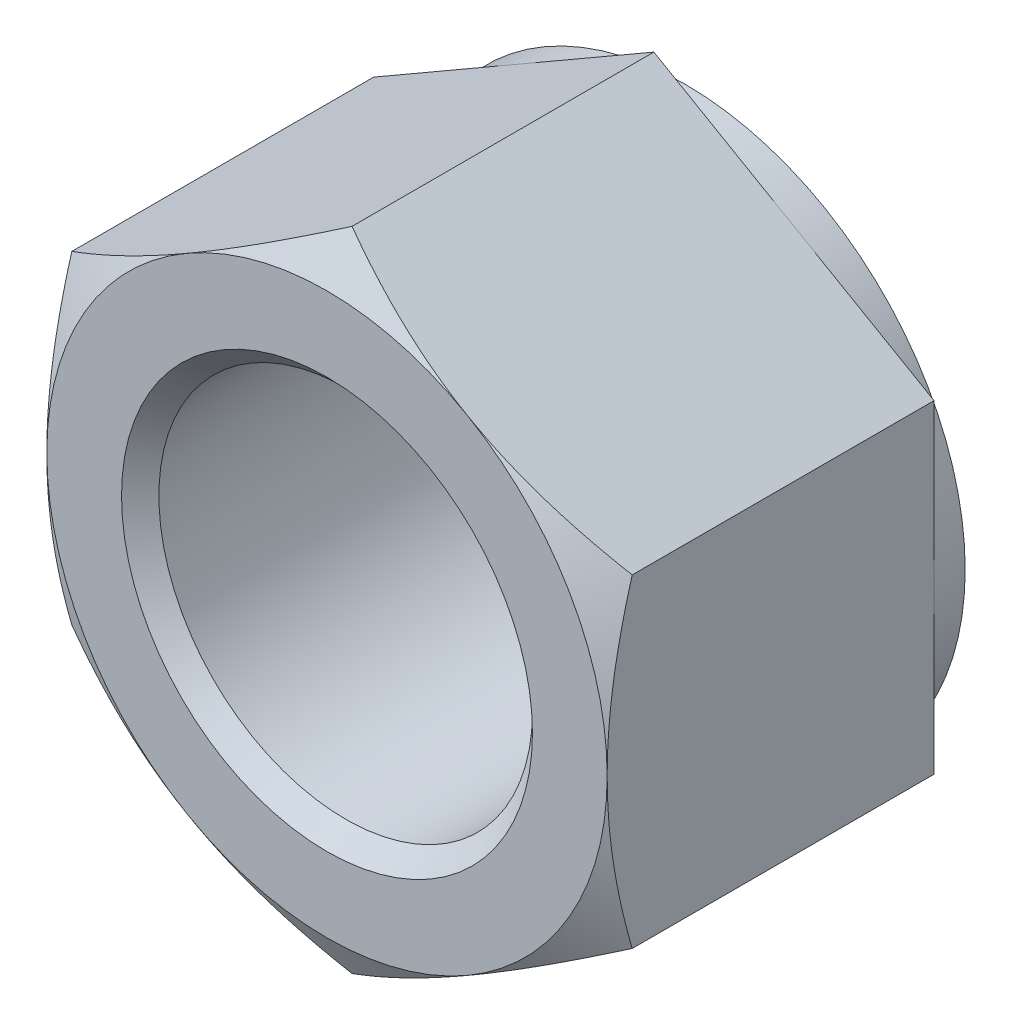
ISO-10303-21;
HEADER;
FILE_DESCRIPTION(('STEP AP214'),'2;1');
FILE_NAME('part.step','',(''),(''),'','','');
FILE_SCHEMA(('AUTOMOTIVE_DESIGN { 1 0 10303 214 1 1 1 1 }'));
ENDSEC;
DATA;
#1=APPLICATION_CONTEXT('core data for automotive mechanical design processes');
#2=APPLICATION_PROTOCOL_DEFINITION('international standard','automotive_design',2000,#1);
#3=PRODUCT_CONTEXT('',#1,'mechanical');
#4=PRODUCT('Part','Part','',(#3));
#5=PRODUCT_RELATED_PRODUCT_CATEGORY('part','',(#4));
#6=PRODUCT_DEFINITION_FORMATION('','',#4);
#7=PRODUCT_DEFINITION_CONTEXT('part definition',#1,'design');
#8=PRODUCT_DEFINITION('design','',#6,#7);
#9=PRODUCT_DEFINITION_SHAPE('','',#8);
#10=(LENGTH_UNIT() NAMED_UNIT(*) SI_UNIT(.MILLI.,.METRE.));
#11=(NAMED_UNIT(*) PLANE_ANGLE_UNIT() SI_UNIT($,.RADIAN.));
#12=(NAMED_UNIT(*) SI_UNIT($,.STERADIAN.) SOLID_ANGLE_UNIT());
#13=UNCERTAINTY_MEASURE_WITH_UNIT(LENGTH_MEASURE(1.E-05),#10,'distance_accuracy_value','');
#14=(GEOMETRIC_REPRESENTATION_CONTEXT(3) GLOBAL_UNCERTAINTY_ASSIGNED_CONTEXT((#13)) GLOBAL_UNIT_ASSIGNED_CONTEXT((#10,
#11,#12)) REPRESENTATION_CONTEXT('',''));
#15=CARTESIAN_POINT('',(0.,0.,0.));
#16=DIRECTION('',(0.,0.,1.));
#17=DIRECTION('',(1.,0.,0.));
#18=AXIS2_PLACEMENT_3D('',#15,#16,#17);
#19=CARTESIAN_POINT('',(0.,-2.59807621135332,0.));
#20=DIRECTION('',(-0.5,-0.866025403784439,0.));
#21=DIRECTION('',(0.,0.,-1.));
#22=AXIS2_PLACEMENT_3D('',#19,#20,#21);
#23=PLANE('',#22);
#24=CARTESIAN_POINT('',(-1.125,-1.94855715851499,1.3125));
#25=CARTESIAN_POINT('',(-1.64711431702998,-1.64711431702997,1.3125));
#26=CARTESIAN_POINT('',(-2.25,-1.29903810567666,1.11153810567666));
#27=(BOUNDED_CURVE() B_SPLINE_CURVE(2,(#24,#25,#26),.UNSPECIFIED.,.F.,
.F.) B_SPLINE_CURVE_WITH_KNOTS((3,3),(0.314084791435265,0.471127187152897),
.UNSPECIFIED.) CURVE() GEOMETRIC_REPRESENTATION_ITEM() RATIONAL_B_SPLINE_CURVE((1.,
1.07735026918963,1.07735026918963)) REPRESENTATION_ITEM(''));
#28=CARTESIAN_POINT('',(-1.125,-1.94855715851499,1.3125));
#29=VERTEX_POINT('',#28);
#30=CARTESIAN_POINT('',(-2.25,-1.29903810567666,1.11153810567666));
#31=VERTEX_POINT('',#30);
#32=EDGE_CURVE('E147',#29,#31,#27,.T.);
#33=ORIENTED_EDGE('',*,*,#32,.T.);
#34=DIRECTION('',(0.,0.,-1.));
#35=VECTOR('',#34,1.);
#36=CARTESIAN_POINT('',(-2.25,-1.29903810567666,0.));
#37=LINE('',#36,#35);
#38=CARTESIAN_POINT('',(-2.25,-1.29903810567666,-1.3125));
#39=VERTEX_POINT('',#38);
#40=EDGE_CURVE('E182',#31,#39,#37,.T.);
#41=ORIENTED_EDGE('',*,*,#40,.T.);
#42=DIRECTION('',(0.866025403784439,-0.5,0.));
#43=VECTOR('',#42,1.);
#44=CARTESIAN_POINT('',(0.,-2.59807621135332,-1.3125));
#45=LINE('',#44,#43);
#46=CARTESIAN_POINT('',(-1.125,-1.94855715851499,-1.3125));
#47=VERTEX_POINT('',#46);
#48=EDGE_CURVE('E135',#39,#47,#45,.T.);
#49=ORIENTED_EDGE('',*,*,#48,.T.);
#50=DIRECTION('',(0.866025403784439,-0.5,0.));
#51=VECTOR('',#50,1.);
#52=CARTESIAN_POINT('',(0.,-2.59807621135332,-1.3125));
#53=LINE('',#52,#51);
#54=CARTESIAN_POINT('',(0.,-2.59807621135332,-1.3125));
#55=VERTEX_POINT('',#54);
#56=EDGE_CURVE('E125',#47,#55,#53,.T.);
#57=ORIENTED_EDGE('',*,*,#56,.T.);
#58=DIRECTION('',(0.,0.,-1.));
#59=VECTOR('',#58,1.);
#60=CARTESIAN_POINT('',(0.,-2.59807621135332,0.));
#61=LINE('',#60,#59);
#62=CARTESIAN_POINT('',(0.,-2.59807621135332,1.11153810567666));
#63=VERTEX_POINT('',#62);
#64=EDGE_CURVE('E11',#63,#55,#61,.T.);
#65=ORIENTED_EDGE('',*,*,#64,.F.);
#66=CARTESIAN_POINT('',(0.,-2.59807621135332,1.11153810567666));
#67=CARTESIAN_POINT('',(-0.602885682970024,-2.25,1.3125));
#68=CARTESIAN_POINT('',(-1.125,-1.94855715851499,1.3125));
#69=(BOUNDED_CURVE() B_SPLINE_CURVE(2,(#66,#67,#68),.UNSPECIFIED.,.F.,
.F.) B_SPLINE_CURVE_WITH_KNOTS((3,3),(0.157042395717633,0.314084791435265),
.UNSPECIFIED.) CURVE() GEOMETRIC_REPRESENTATION_ITEM() RATIONAL_B_SPLINE_CURVE((1.07735026918962,
1.07735026918962,1.)) REPRESENTATION_ITEM(''));
#70=EDGE_CURVE('E243',#63,#29,#69,.T.);
#71=ORIENTED_EDGE('',*,*,#70,.T.);
#72=EDGE_LOOP('',(#33,#41,#49,#57,#65,#71));
#73=FACE_BOUND('',#72,.T.);
#74=ADVANCED_FACE('F16',(#73),#23,.T.);
#75=CARTESIAN_POINT('',(2.25,-1.29903810567666,0.));
#76=DIRECTION('',(0.5,-0.866025403784439,0.));
#77=DIRECTION('',(0.,0.,-1.));
#78=AXIS2_PLACEMENT_3D('',#75,#76,#77);
#79=PLANE('',#78);
#80=CARTESIAN_POINT('',(1.125,-1.94855715851499,1.3125));
#81=CARTESIAN_POINT('',(0.602885682970024,-2.25,1.3125));
#82=CARTESIAN_POINT('',(0.,-2.59807621135332,1.11153810567666));
#83=(BOUNDED_CURVE() B_SPLINE_CURVE(2,(#80,#81,#82),.UNSPECIFIED.,.F.,
.F.) B_SPLINE_CURVE_WITH_KNOTS((3,3),(0.314084791435265,0.471127187152897),
.UNSPECIFIED.) CURVE() GEOMETRIC_REPRESENTATION_ITEM() RATIONAL_B_SPLINE_CURVE((1.,
1.07735026918963,1.07735026918963)) REPRESENTATION_ITEM(''));
#84=CARTESIAN_POINT('',(1.125,-1.94855715851499,1.3125));
#85=VERTEX_POINT('',#84);
#86=EDGE_CURVE('E166',#85,#63,#83,.T.);
#87=ORIENTED_EDGE('',*,*,#86,.T.);
#88=ORIENTED_EDGE('',*,*,#64,.T.);
#89=DIRECTION('',(0.866025403784439,0.5,0.));
#90=VECTOR('',#89,1.);
#91=CARTESIAN_POINT('',(2.25,-1.29903810567666,-1.3125));
#92=LINE('',#91,#90);
#93=CARTESIAN_POINT('',(1.125,-1.94855715851499,-1.3125));
#94=VERTEX_POINT('',#93);
#95=EDGE_CURVE('E118',#55,#94,#92,.T.);
#96=ORIENTED_EDGE('',*,*,#95,.T.);
#97=DIRECTION('',(0.866025403784439,0.5,0.));
#98=VECTOR('',#97,1.);
#99=CARTESIAN_POINT('',(2.25,-1.29903810567666,-1.3125));
#100=LINE('',#99,#98);
#101=CARTESIAN_POINT('',(2.25,-1.29903810567666,-1.3125));
#102=VERTEX_POINT('',#101);
#103=EDGE_CURVE('E105',#94,#102,#100,.T.);
#104=ORIENTED_EDGE('',*,*,#103,.T.);
#105=DIRECTION('',(0.,0.,-1.));
#106=VECTOR('',#105,1.);
#107=CARTESIAN_POINT('',(2.25,-1.29903810567666,0.));
#108=LINE('',#107,#106);
#109=CARTESIAN_POINT('',(2.25,-1.29903810567666,1.11153810567666));
#110=VERTEX_POINT('',#109);
#111=EDGE_CURVE('E27',#110,#102,#108,.T.);
#112=ORIENTED_EDGE('',*,*,#111,.F.);
#113=CARTESIAN_POINT('',(2.25,-1.29903810567666,1.11153810567666));
#114=CARTESIAN_POINT('',(1.64711431702998,-1.64711431702997,1.3125));
#115=CARTESIAN_POINT('',(1.125,-1.94855715851499,1.3125));
#116=(BOUNDED_CURVE() B_SPLINE_CURVE(2,(#113,#114,#115),.UNSPECIFIED.,.F.,
.F.) B_SPLINE_CURVE_WITH_KNOTS((3,3),(0.157042395717633,0.314084791435265),
.UNSPECIFIED.) CURVE() GEOMETRIC_REPRESENTATION_ITEM() RATIONAL_B_SPLINE_CURVE((1.07735026918963,
1.07735026918963,1.)) REPRESENTATION_ITEM(''));
#117=EDGE_CURVE('E200',#110,#85,#116,.T.);
#118=ORIENTED_EDGE('',*,*,#117,.T.);
#119=EDGE_LOOP('',(#87,#88,#96,#104,#112,#118));
#120=FACE_BOUND('',#119,.T.);
#121=ADVANCED_FACE('F121',(#120),#79,.T.);
#122=CARTESIAN_POINT('',(2.25,1.29903810567665,0.));
#123=DIRECTION('',(1.,0.,0.));
#124=DIRECTION('',(0.,0.,-1.));
#125=AXIS2_PLACEMENT_3D('',#122,#123,#124);
#126=PLANE('',#125);
#127=CARTESIAN_POINT('',(2.25,0.,1.3125));
#128=CARTESIAN_POINT('',(2.25,-0.602885682970031,1.3125));
#129=CARTESIAN_POINT('',(2.25,-1.29903810567666,1.11153810567666));
#130=(BOUNDED_CURVE() B_SPLINE_CURVE(2,(#127,#128,#129),.UNSPECIFIED.,.F.,
.F.) B_SPLINE_CURVE_WITH_KNOTS((3,3),(0.314084791435265,0.471127187152897),
.UNSPECIFIED.) CURVE() GEOMETRIC_REPRESENTATION_ITEM() RATIONAL_B_SPLINE_CURVE((1.,
1.07735026918962,1.07735026918962)) REPRESENTATION_ITEM(''));
#131=CARTESIAN_POINT('',(2.25,0.,1.3125));
#132=VERTEX_POINT('',#131);
#133=EDGE_CURVE('E205',#132,#110,#130,.T.);
#134=ORIENTED_EDGE('',*,*,#133,.T.);
#135=ORIENTED_EDGE('',*,*,#111,.T.);
#136=DIRECTION('',(0.,1.,0.));
#137=VECTOR('',#136,1.);
#138=CARTESIAN_POINT('',(2.25,1.29903810567665,-1.3125));
#139=LINE('',#138,#137);
#140=CARTESIAN_POINT('',(2.25,0.,-1.3125));
#141=VERTEX_POINT('',#140);
#142=EDGE_CURVE('E20',#102,#141,#139,.T.);
#143=ORIENTED_EDGE('',*,*,#142,.T.);
#144=DIRECTION('',(0.,1.,0.));
#145=VECTOR('',#144,1.);
#146=CARTESIAN_POINT('',(2.25,1.29903810567665,-1.3125));
#147=LINE('',#146,#145);
#148=CARTESIAN_POINT('',(2.25,1.29903810567665,-1.3125));
#149=VERTEX_POINT('',#148);
#150=EDGE_CURVE('E196',#141,#149,#147,.T.);
#151=ORIENTED_EDGE('',*,*,#150,.T.);
#152=DIRECTION('',(0.,0.,-1.));
#153=VECTOR('',#152,1.);
#154=CARTESIAN_POINT('',(2.25,1.29903810567665,0.));
#155=LINE('',#154,#153);
#156=CARTESIAN_POINT('',(2.25,1.29903810567665,1.11153810567666));
#157=VERTEX_POINT('',#156);
#158=EDGE_CURVE('E36',#157,#149,#155,.T.);
#159=ORIENTED_EDGE('',*,*,#158,.F.);
#160=CARTESIAN_POINT('',(2.25,1.29903810567666,1.11153810567666));
#161=CARTESIAN_POINT('',(2.25,0.602885682970029,1.3125));
#162=CARTESIAN_POINT('',(2.25,0.,1.3125));
#163=(BOUNDED_CURVE() B_SPLINE_CURVE(2,(#160,#161,#162),.UNSPECIFIED.,.F.,
.F.) B_SPLINE_CURVE_WITH_KNOTS((3,3),(0.157042395717634,0.314084791435265),
.UNSPECIFIED.) CURVE() GEOMETRIC_REPRESENTATION_ITEM() RATIONAL_B_SPLINE_CURVE((1.07735026918962,
1.07735026918962,1.)) REPRESENTATION_ITEM(''));
#164=EDGE_CURVE('E167',#157,#132,#163,.T.);
#165=ORIENTED_EDGE('',*,*,#164,.T.);
#166=EDGE_LOOP('',(#134,#135,#143,#151,#159,#165));
#167=FACE_BOUND('',#166,.T.);
#168=ADVANCED_FACE('F300',(#167),#126,.T.);
#169=CARTESIAN_POINT('',(0.,2.59807621135332,0.));
#170=DIRECTION('',(0.5,0.866025403784439,0.));
#171=DIRECTION('',(0.,0.,-1.));
#172=AXIS2_PLACEMENT_3D('',#169,#170,#171);
#173=PLANE('',#172);
#174=CARTESIAN_POINT('',(0.,2.59807621135332,1.11153810567666));
#175=CARTESIAN_POINT('',(0.602885682970022,2.25,1.3125));
#176=CARTESIAN_POINT('',(1.125,1.94855715851499,1.3125));
#177=(BOUNDED_CURVE() B_SPLINE_CURVE(2,(#174,#175,#176),.UNSPECIFIED.,.F.,
.F.) B_SPLINE_CURVE_WITH_KNOTS((3,3),(0.157042395717633,0.314084791435265),
.UNSPECIFIED.) CURVE() GEOMETRIC_REPRESENTATION_ITEM() RATIONAL_B_SPLINE_CURVE((1.07735026918962,
1.07735026918962,1.)) REPRESENTATION_ITEM(''));
#178=CARTESIAN_POINT('',(0.,2.59807621135332,1.11153810567666));
#179=VERTEX_POINT('',#178);
#180=CARTESIAN_POINT('',(1.125,1.94855715851499,1.3125));
#181=VERTEX_POINT('',#180);
#182=EDGE_CURVE('E156',#179,#181,#177,.T.);
#183=ORIENTED_EDGE('',*,*,#182,.T.);
#184=CARTESIAN_POINT('',(1.125,1.94855715851499,1.3125));
#185=CARTESIAN_POINT('',(1.64711431702998,1.64711431702997,1.3125));
#186=CARTESIAN_POINT('',(2.25,1.29903810567666,1.11153810567666));
#187=(BOUNDED_CURVE() B_SPLINE_CURVE(2,(#184,#185,#186),.UNSPECIFIED.,.F.,
.F.) B_SPLINE_CURVE_WITH_KNOTS((3,3),(0.314084791435265,0.471127187152897),
.UNSPECIFIED.) CURVE() GEOMETRIC_REPRESENTATION_ITEM() RATIONAL_B_SPLINE_CURVE((1.,
1.07735026918963,1.07735026918963)) REPRESENTATION_ITEM(''));
#188=EDGE_CURVE('E175',#181,#157,#187,.T.);
#189=ORIENTED_EDGE('',*,*,#188,.T.);
#190=ORIENTED_EDGE('',*,*,#158,.T.);
#191=DIRECTION('',(-0.866025403784439,0.5,0.));
#192=VECTOR('',#191,1.);
#193=CARTESIAN_POINT('',(0.,2.59807621135332,-1.3125));
#194=LINE('',#193,#192);
#195=CARTESIAN_POINT('',(1.125,1.94855715851499,-1.3125));
#196=VERTEX_POINT('',#195);
#197=EDGE_CURVE('E115',#149,#196,#194,.T.);
#198=ORIENTED_EDGE('',*,*,#197,.T.);
#199=DIRECTION('',(-0.866025403784439,0.5,0.));
#200=VECTOR('',#199,1.);
#201=CARTESIAN_POINT('',(0.,2.59807621135332,-1.3125));
#202=LINE('',#201,#200);
#203=CARTESIAN_POINT('',(0.,2.59807621135332,-1.3125));
#204=VERTEX_POINT('',#203);
#205=EDGE_CURVE('E217',#196,#204,#202,.T.);
#206=ORIENTED_EDGE('',*,*,#205,.T.);
#207=DIRECTION('',(0.,0.,1.));
#208=VECTOR('',#207,1.);
#209=CARTESIAN_POINT('',(0.,2.59807621135332,0.));
#210=LINE('',#209,#208);
#211=EDGE_CURVE('E185',#204,#179,#210,.T.);
#212=ORIENTED_EDGE('',*,*,#211,.T.);
#213=EDGE_LOOP('',(#183,#189,#190,#198,#206,#212));
#214=FACE_BOUND('',#213,.T.);
#215=ADVANCED_FACE('F354',(#214),#173,.T.);
#216=CARTESIAN_POINT('',(-2.25,1.29903810567665,0.));
#217=DIRECTION('',(-0.5,0.866025403784438,0.));
#218=DIRECTION('',(0.,0.,1.));
#219=AXIS2_PLACEMENT_3D('',#216,#217,#218);
#220=PLANE('',#219);
#221=CARTESIAN_POINT('',(-2.25,1.29903810567666,1.11153810567666));
#222=CARTESIAN_POINT('',(-1.64711431702998,1.64711431702997,1.3125));
#223=CARTESIAN_POINT('',(-1.125,1.94855715851499,1.3125));
#224=(BOUNDED_CURVE() B_SPLINE_CURVE(2,(#221,#222,#223),.UNSPECIFIED.,.F.,
.F.) B_SPLINE_CURVE_WITH_KNOTS((3,3),(0.157042395717633,0.314084791435265),
.UNSPECIFIED.) CURVE() GEOMETRIC_REPRESENTATION_ITEM() RATIONAL_B_SPLINE_CURVE((1.07735026918962,
1.07735026918962,1.)) REPRESENTATION_ITEM(''));
#225=CARTESIAN_POINT('',(-2.25,1.29903810567665,1.11153810567666));
#226=VERTEX_POINT('',#225);
#227=CARTESIAN_POINT('',(-1.125,1.94855715851499,1.3125));
#228=VERTEX_POINT('',#227);
#229=EDGE_CURVE('E157',#226,#228,#224,.T.);
#230=ORIENTED_EDGE('',*,*,#229,.T.);
#231=CARTESIAN_POINT('',(-1.125,1.94855715851499,1.3125));
#232=CARTESIAN_POINT('',(-0.602885682970026,2.25,1.3125));
#233=CARTESIAN_POINT('',(0.,2.59807621135332,1.11153810567666));
#234=(BOUNDED_CURVE() B_SPLINE_CURVE(2,(#231,#232,#233),.UNSPECIFIED.,.F.,
.F.) B_SPLINE_CURVE_WITH_KNOTS((3,3),(0.314084791435265,0.471127187152897),
.UNSPECIFIED.) CURVE() GEOMETRIC_REPRESENTATION_ITEM() RATIONAL_B_SPLINE_CURVE((1.,
1.07735026918963,1.07735026918963)) REPRESENTATION_ITEM(''));
#235=EDGE_CURVE('E151',#228,#179,#234,.T.);
#236=ORIENTED_EDGE('',*,*,#235,.T.);
#237=ORIENTED_EDGE('',*,*,#211,.F.);
#238=DIRECTION('',(-0.866025403784438,-0.5,0.));
#239=VECTOR('',#238,1.);
#240=CARTESIAN_POINT('',(-2.25,1.29903810567665,-1.3125));
#241=LINE('',#240,#239);
#242=CARTESIAN_POINT('',(-1.125,1.94855715851499,-1.3125));
#243=VERTEX_POINT('',#242);
#244=EDGE_CURVE('E199',#204,#243,#241,.T.);
#245=ORIENTED_EDGE('',*,*,#244,.T.);
#246=DIRECTION('',(-0.866025403784438,-0.5,0.));
#247=VECTOR('',#246,1.);
#248=CARTESIAN_POINT('',(-2.25,1.29903810567665,-1.3125));
#249=LINE('',#248,#247);
#250=CARTESIAN_POINT('',(-2.25,1.29903810567665,-1.3125));
#251=VERTEX_POINT('',#250);
#252=EDGE_CURVE('E206',#243,#251,#249,.T.);
#253=ORIENTED_EDGE('',*,*,#252,.T.);
#254=DIRECTION('',(0.,0.,-1.));
#255=VECTOR('',#254,1.);
#256=CARTESIAN_POINT('',(-2.25,1.29903810567665,0.));
#257=LINE('',#256,#255);
#258=EDGE_CURVE('E174',#226,#251,#257,.T.);
#259=ORIENTED_EDGE('',*,*,#258,.F.);
#260=EDGE_LOOP('',(#230,#236,#237,#245,#253,#259));
#261=FACE_BOUND('',#260,.T.);
#262=ADVANCED_FACE('F336',(#261),#220,.T.);
#263=CARTESIAN_POINT('',(-2.25,-1.29903810567666,0.));
#264=DIRECTION('',(-1.,0.,0.));
#265=DIRECTION('',(0.,0.,1.));
#266=AXIS2_PLACEMENT_3D('',#263,#264,#265);
#267=PLANE('',#266);
#268=CARTESIAN_POINT('',(-2.25,-1.29903810567666,1.11153810567666));
#269=CARTESIAN_POINT('',(-2.25,-0.602885682970032,1.3125));
#270=CARTESIAN_POINT('',(-2.25,0.,1.3125));
#271=(BOUNDED_CURVE() B_SPLINE_CURVE(2,(#268,#269,#270),.UNSPECIFIED.,.F.,
.F.) B_SPLINE_CURVE_WITH_KNOTS((3,3),(0.157042395717633,0.314084791435265),
.UNSPECIFIED.) CURVE() GEOMETRIC_REPRESENTATION_ITEM() RATIONAL_B_SPLINE_CURVE((1.07735026918963,
1.07735026918963,1.)) REPRESENTATION_ITEM(''));
#272=CARTESIAN_POINT('',(-2.25,0.,1.3125));
#273=VERTEX_POINT('',#272);
#274=EDGE_CURVE('E158',#31,#273,#271,.T.);
#275=ORIENTED_EDGE('',*,*,#274,.T.);
#276=CARTESIAN_POINT('',(-2.25,0.,1.3125));
#277=CARTESIAN_POINT('',(-2.25,0.602885682970026,1.3125));
#278=CARTESIAN_POINT('',(-2.25,1.29903810567665,1.11153810567666));
#279=(BOUNDED_CURVE() B_SPLINE_CURVE(2,(#276,#277,#278),.UNSPECIFIED.,.F.,
.F.) B_SPLINE_CURVE_WITH_KNOTS((3,3),(0.314084791435265,0.471127187152897),
.UNSPECIFIED.) CURVE() GEOMETRIC_REPRESENTATION_ITEM() RATIONAL_B_SPLINE_CURVE((1.,
1.07735026918962,1.07735026918962)) REPRESENTATION_ITEM(''));
#280=EDGE_CURVE('E233',#273,#226,#279,.T.);
#281=ORIENTED_EDGE('',*,*,#280,.T.);
#282=ORIENTED_EDGE('',*,*,#258,.T.);
#283=DIRECTION('',(0.,-1.,0.));
#284=VECTOR('',#283,1.);
#285=CARTESIAN_POINT('',(-2.25,-1.29903810567666,-1.3125));
#286=LINE('',#285,#284);
#287=CARTESIAN_POINT('',(-2.25,0.,-1.3125));
#288=VERTEX_POINT('',#287);
#289=EDGE_CURVE('E221',#251,#288,#286,.T.);
#290=ORIENTED_EDGE('',*,*,#289,.T.);
#291=DIRECTION('',(0.,-1.,0.));
#292=VECTOR('',#291,1.);
#293=CARTESIAN_POINT('',(-2.25,-1.29903810567666,-1.3125));
#294=LINE('',#293,#292);
#295=EDGE_CURVE('E126',#288,#39,#294,.T.);
#296=ORIENTED_EDGE('',*,*,#295,.T.);
#297=ORIENTED_EDGE('',*,*,#40,.F.);
#298=EDGE_LOOP('',(#275,#281,#282,#290,#296,#297));
#299=FACE_BOUND('',#298,.T.);
#300=ADVANCED_FACE('F345',(#299),#267,.T.);
#301=CARTESIAN_POINT('',(0.,0.,0.879487298107781));
#302=DIRECTION('',(0.,0.,-1.));
#303=DIRECTION('',(1.,0.,0.));
#304=AXIS2_PLACEMENT_3D('',#301,#302,#303);
#305=CONICAL_SURFACE('',#304,3.,1.0471975511966);
#306=ORIENTED_EDGE('',*,*,#188,.F.);
#307=CARTESIAN_POINT('',(0.,0.,1.3125));
#308=DIRECTION('',(0.,0.,1.));
#309=DIRECTION('',(1.,0.,0.));
#310=AXIS2_PLACEMENT_3D('',#307,#308,#309);
#311=CIRCLE('',#310,2.25);
#312=EDGE_CURVE('E186',#132,#181,#311,.T.);
#313=ORIENTED_EDGE('',*,*,#312,.F.);
#314=ORIENTED_EDGE('',*,*,#164,.F.);
#315=EDGE_LOOP('',(#306,#313,#314));
#316=FACE_BOUND('',#315,.T.);
#317=ADVANCED_FACE('F390',(#316),#305,.T.);
#318=CARTESIAN_POINT('',(0.,0.,0.879487298107781));
#319=DIRECTION('',(0.,0.,-1.));
#320=DIRECTION('',(1.,0.,0.));
#321=AXIS2_PLACEMENT_3D('',#318,#319,#320);
#322=CONICAL_SURFACE('',#321,3.,1.0471975511966);
#323=ORIENTED_EDGE('',*,*,#235,.F.);
#324=CARTESIAN_POINT('',(0.,0.,1.3125));
#325=DIRECTION('',(0.,0.,1.));
#326=DIRECTION('',(1.,0.,0.));
#327=AXIS2_PLACEMENT_3D('',#324,#325,#326);
#328=CIRCLE('',#327,2.25);
#329=EDGE_CURVE('E189',#181,#228,#328,.T.);
#330=ORIENTED_EDGE('',*,*,#329,.F.);
#331=ORIENTED_EDGE('',*,*,#182,.F.);
#332=EDGE_LOOP('',(#323,#330,#331));
#333=FACE_BOUND('',#332,.T.);
#334=ADVANCED_FACE('F404',(#333),#322,.T.);
#335=CARTESIAN_POINT('',(0.,0.,0.879487298107781));
#336=DIRECTION('',(0.,0.,-1.));
#337=DIRECTION('',(1.,0.,0.));
#338=AXIS2_PLACEMENT_3D('',#335,#336,#337);
#339=CONICAL_SURFACE('',#338,3.,1.0471975511966);
#340=ORIENTED_EDGE('',*,*,#280,.F.);
#341=CARTESIAN_POINT('',(0.,0.,1.3125));
#342=DIRECTION('',(0.,0.,1.));
#343=DIRECTION('',(1.,0.,0.));
#344=AXIS2_PLACEMENT_3D('',#341,#342,#343);
#345=CIRCLE('',#344,2.25);
#346=EDGE_CURVE('E207',#228,#273,#345,.T.);
#347=ORIENTED_EDGE('',*,*,#346,.F.);
#348=ORIENTED_EDGE('',*,*,#229,.F.);
#349=EDGE_LOOP('',(#340,#347,#348));
#350=FACE_BOUND('',#349,.T.);
#351=ADVANCED_FACE('F401',(#350),#339,.T.);
#352=CARTESIAN_POINT('',(0.,0.,0.879487298107781));
#353=DIRECTION('',(0.,0.,-1.));
#354=DIRECTION('',(1.,0.,0.));
#355=AXIS2_PLACEMENT_3D('',#352,#353,#354);
#356=CONICAL_SURFACE('',#355,3.,1.0471975511966);
#357=ORIENTED_EDGE('',*,*,#274,.F.);
#358=ORIENTED_EDGE('',*,*,#32,.F.);
#359=CARTESIAN_POINT('',(0.,0.,1.3125));
#360=DIRECTION('',(0.,0.,1.));
#361=DIRECTION('',(1.,0.,0.));
#362=AXIS2_PLACEMENT_3D('',#359,#360,#361);
#363=CIRCLE('',#362,2.25);
#364=EDGE_CURVE('E213',#273,#29,#363,.T.);
#365=ORIENTED_EDGE('',*,*,#364,.F.);
#366=EDGE_LOOP('',(#357,#358,#365));
#367=FACE_BOUND('',#366,.T.);
#368=ADVANCED_FACE('F398',(#367),#356,.T.);
#369=CARTESIAN_POINT('',(0.,0.,0.879487298107781));
#370=DIRECTION('',(0.,0.,-1.));
#371=DIRECTION('',(1.,0.,0.));
#372=AXIS2_PLACEMENT_3D('',#369,#370,#371);
#373=CONICAL_SURFACE('',#372,3.,1.0471975511966);
#374=ORIENTED_EDGE('',*,*,#70,.F.);
#375=ORIENTED_EDGE('',*,*,#86,.F.);
#376=CARTESIAN_POINT('',(0.,0.,1.3125));
#377=DIRECTION('',(0.,0.,1.));
#378=DIRECTION('',(1.,0.,0.));
#379=AXIS2_PLACEMENT_3D('',#376,#377,#378);
#380=CIRCLE('',#379,2.25);
#381=EDGE_CURVE('E195',#29,#85,#380,.T.);
#382=ORIENTED_EDGE('',*,*,#381,.F.);
#383=EDGE_LOOP('',(#374,#375,#382));
#384=FACE_BOUND('',#383,.T.);
#385=ADVANCED_FACE('F309',(#384),#373,.T.);
#386=CARTESIAN_POINT('',(0.,0.,0.879487298107781));
#387=DIRECTION('',(0.,0.,-1.));
#388=DIRECTION('',(1.,0.,0.));
#389=AXIS2_PLACEMENT_3D('',#386,#387,#388);
#390=CONICAL_SURFACE('',#389,3.,1.0471975511966);
#391=ORIENTED_EDGE('',*,*,#117,.F.);
#392=ORIENTED_EDGE('',*,*,#133,.F.);
#393=CARTESIAN_POINT('',(0.,0.,1.3125));
#394=DIRECTION('',(0.,0.,1.));
#395=DIRECTION('',(1.,0.,0.));
#396=AXIS2_PLACEMENT_3D('',#393,#394,#395);
#397=CIRCLE('',#396,2.25);
#398=EDGE_CURVE('E191',#85,#132,#397,.T.);
#399=ORIENTED_EDGE('',*,*,#398,.F.);
#400=EDGE_LOOP('',(#391,#392,#399));
#401=FACE_BOUND('',#400,.T.);
#402=ADVANCED_FACE('F304',(#401),#390,.T.);
#403=CARTESIAN_POINT('',(0.,0.,-1.3125));
#404=DIRECTION('',(0.,0.,1.));
#405=DIRECTION('',(1.,0.,0.));
#406=AXIS2_PLACEMENT_3D('',#403,#404,#405);
#407=PLANE('',#406);
#408=CARTESIAN_POINT('',(0.,0.,-1.3125));
#409=DIRECTION('',(0.,0.,1.));
#410=DIRECTION('',(1.,0.,0.));
#411=AXIS2_PLACEMENT_3D('',#408,#409,#410);
#412=CIRCLE('',#411,2.25);
#413=EDGE_CURVE('E214',#243,#288,#412,.T.);
#414=ORIENTED_EDGE('',*,*,#413,.T.);
#415=ORIENTED_EDGE('',*,*,#289,.F.);
#416=ORIENTED_EDGE('',*,*,#252,.F.);
#417=EDGE_LOOP('',(#414,#415,#416));
#418=FACE_BOUND('',#417,.T.);
#419=ADVANCED_FACE('F341',(#418),#407,.F.);
#420=CARTESIAN_POINT('',(0.,0.,-1.3125));
#421=DIRECTION('',(0.,0.,1.));
#422=DIRECTION('',(1.,0.,0.));
#423=AXIS2_PLACEMENT_3D('',#420,#421,#422);
#424=PLANE('',#423);
#425=CARTESIAN_POINT('',(0.,0.,-1.3125));
#426=DIRECTION('',(0.,0.,1.));
#427=DIRECTION('',(1.,0.,0.));
#428=AXIS2_PLACEMENT_3D('',#425,#426,#427);
#429=CIRCLE('',#428,2.25);
#430=EDGE_CURVE('E143',#196,#243,#429,.T.);
#431=ORIENTED_EDGE('',*,*,#430,.T.);
#432=ORIENTED_EDGE('',*,*,#244,.F.);
#433=ORIENTED_EDGE('',*,*,#205,.F.);
#434=EDGE_LOOP('',(#431,#432,#433));
#435=FACE_BOUND('',#434,.T.);
#436=ADVANCED_FACE('F351',(#435),#424,.F.);
#437=CARTESIAN_POINT('',(0.,0.,-1.3125));
#438=DIRECTION('',(0.,0.,1.));
#439=DIRECTION('',(1.,0.,0.));
#440=AXIS2_PLACEMENT_3D('',#437,#438,#439);
#441=PLANE('',#440);
#442=CARTESIAN_POINT('',(0.,0.,-1.3125));
#443=DIRECTION('',(0.,0.,1.));
#444=DIRECTION('',(1.,0.,0.));
#445=AXIS2_PLACEMENT_3D('',#442,#443,#444);
#446=CIRCLE('',#445,2.25);
#447=EDGE_CURVE('E141',#141,#196,#446,.T.);
#448=ORIENTED_EDGE('',*,*,#447,.T.);
#449=ORIENTED_EDGE('',*,*,#197,.F.);
#450=ORIENTED_EDGE('',*,*,#150,.F.);
#451=EDGE_LOOP('',(#448,#449,#450));
#452=FACE_BOUND('',#451,.T.);
#453=ADVANCED_FACE('F356',(#452),#441,.F.);
#454=CARTESIAN_POINT('',(0.,0.,-1.3125));
#455=DIRECTION('',(0.,0.,1.));
#456=DIRECTION('',(1.,0.,0.));
#457=AXIS2_PLACEMENT_3D('',#454,#455,#456);
#458=PLANE('',#457);
#459=CARTESIAN_POINT('',(0.,0.,-1.3125));
#460=DIRECTION('',(0.,0.,1.));
#461=DIRECTION('',(1.,0.,0.));
#462=AXIS2_PLACEMENT_3D('',#459,#460,#461);
#463=CIRCLE('',#462,2.25);
#464=EDGE_CURVE('E109',#94,#141,#463,.T.);
#465=ORIENTED_EDGE('',*,*,#464,.T.);
#466=ORIENTED_EDGE('',*,*,#142,.F.);
#467=ORIENTED_EDGE('',*,*,#103,.F.);
#468=EDGE_LOOP('',(#465,#466,#467));
#469=FACE_BOUND('',#468,.T.);
#470=ADVANCED_FACE('F107',(#469),#458,.F.);
#471=CARTESIAN_POINT('',(0.,0.,-1.3125));
#472=DIRECTION('',(0.,0.,1.));
#473=DIRECTION('',(1.,0.,0.));
#474=AXIS2_PLACEMENT_3D('',#471,#472,#473);
#475=PLANE('',#474);
#476=CARTESIAN_POINT('',(0.,0.,-1.3125));
#477=DIRECTION('',(0.,0.,1.));
#478=DIRECTION('',(1.,0.,0.));
#479=AXIS2_PLACEMENT_3D('',#476,#477,#478);
#480=CIRCLE('',#479,2.25);
#481=EDGE_CURVE('E129',#47,#94,#480,.T.);
#482=ORIENTED_EDGE('',*,*,#481,.T.);
#483=ORIENTED_EDGE('',*,*,#95,.F.);
#484=ORIENTED_EDGE('',*,*,#56,.F.);
#485=EDGE_LOOP('',(#482,#483,#484));
#486=FACE_BOUND('',#485,.T.);
#487=ADVANCED_FACE('F130',(#486),#475,.F.);
#488=CARTESIAN_POINT('',(0.,0.,-1.3125));
#489=DIRECTION('',(0.,0.,1.));
#490=DIRECTION('',(1.,0.,0.));
#491=AXIS2_PLACEMENT_3D('',#488,#489,#490);
#492=PLANE('',#491);
#493=CARTESIAN_POINT('',(0.,0.,-1.3125));
#494=DIRECTION('',(0.,0.,1.));
#495=DIRECTION('',(1.,0.,0.));
#496=AXIS2_PLACEMENT_3D('',#493,#494,#495);
#497=CIRCLE('',#496,2.25);
#498=EDGE_CURVE('E194',#288,#47,#497,.T.);
#499=ORIENTED_EDGE('',*,*,#498,.T.);
#500=ORIENTED_EDGE('',*,*,#48,.F.);
#501=ORIENTED_EDGE('',*,*,#295,.F.);
#502=EDGE_LOOP('',(#499,#500,#501));
#503=FACE_BOUND('',#502,.T.);
#504=ADVANCED_FACE('F349',(#503),#492,.F.);
#505=CARTESIAN_POINT('',(0.,0.,-1.3125));
#506=DIRECTION('',(0.,0.,1.));
#507=DIRECTION('',(1.,0.,0.));
#508=AXIS2_PLACEMENT_3D('',#505,#506,#507);
#509=CYLINDRICAL_SURFACE('',#508,2.25);
#510=ORIENTED_EDGE('',*,*,#498,.F.);
#511=ORIENTED_EDGE('',*,*,#413,.F.);
#512=ORIENTED_EDGE('',*,*,#430,.F.);
#513=ORIENTED_EDGE('',*,*,#447,.F.);
#514=ORIENTED_EDGE('',*,*,#464,.F.);
#515=ORIENTED_EDGE('',*,*,#481,.F.);
#516=EDGE_LOOP('',(#510,#511,#512,#513,#514,#515));
#517=FACE_BOUND('',#516,.T.);
#518=CARTESIAN_POINT('',(0.,0.,-1.5625));
#519=DIRECTION('',(0.,0.,1.));
#520=DIRECTION('',(1.,0.,0.));
#521=AXIS2_PLACEMENT_3D('',#518,#519,#520);
#522=CIRCLE('',#521,2.25);
#523=CARTESIAN_POINT('',(-2.25,0.,-1.5625));
#524=VERTEX_POINT('',#523);
#525=EDGE_CURVE('E280',#524,#524,#522,.T.);
#526=ORIENTED_EDGE('',*,*,#525,.T.);
#527=EDGE_LOOP('',(#526));
#528=FACE_BOUND('',#527,.T.);
#529=ADVANCED_FACE('F137',(#517,#528),#509,.T.);
#530=CARTESIAN_POINT('',(0.,0.,1.3125));
#531=DIRECTION('',(0.,0.,1.));
#532=DIRECTION('',(1.,0.,0.));
#533=AXIS2_PLACEMENT_3D('',#530,#531,#532);
#534=PLANE('',#533);
#535=CARTESIAN_POINT('',(0.,0.,1.3125));
#536=DIRECTION('',(0.,0.,1.));
#537=DIRECTION('',(-1.,0.,0.));
#538=AXIS2_PLACEMENT_3D('',#535,#536,#537);
#539=CIRCLE('',#538,1.65);
#540=CARTESIAN_POINT('',(1.65,0.,1.3125));
#541=VERTEX_POINT('',#540);
#542=EDGE_CURVE('E190',#541,#541,#539,.T.);
#543=ORIENTED_EDGE('',*,*,#542,.F.);
#544=EDGE_LOOP('',(#543));
#545=FACE_BOUND('',#544,.T.);
#546=ORIENTED_EDGE('',*,*,#312,.T.);
#547=ORIENTED_EDGE('',*,*,#329,.T.);
#548=ORIENTED_EDGE('',*,*,#346,.T.);
#549=ORIENTED_EDGE('',*,*,#364,.T.);
#550=ORIENTED_EDGE('',*,*,#381,.T.);
#551=ORIENTED_EDGE('',*,*,#398,.T.);
#552=EDGE_LOOP('',(#546,#547,#548,#549,#550,#551));
#553=FACE_BOUND('',#552,.T.);
#554=ADVANCED_FACE('F374',(#545,#553),#534,.T.);
#555=CARTESIAN_POINT('',(0.,0.,1.2375));
#556=DIRECTION('',(0.,0.,1.));
#557=DIRECTION('',(-1.,0.,0.));
#558=AXIS2_PLACEMENT_3D('',#555,#556,#557);
#559=CONICAL_SURFACE('',#558,1.575,0.78539816339745);
#560=ORIENTED_EDGE('',*,*,#542,.T.);
#561=EDGE_LOOP('',(#560));
#562=FACE_BOUND('',#561,.T.);
#563=CARTESIAN_POINT('',(0.,0.,1.1625));
#564=DIRECTION('',(0.,0.,-1.));
#565=DIRECTION('',(-1.,0.,0.));
#566=AXIS2_PLACEMENT_3D('',#563,#564,#565);
#567=CIRCLE('',#566,1.5);
#568=CARTESIAN_POINT('',(1.5,0.,1.1625));
#569=VERTEX_POINT('',#568);
#570=EDGE_CURVE('E275',#569,#569,#567,.T.);
#571=ORIENTED_EDGE('',*,*,#570,.T.);
#572=EDGE_LOOP('',(#571));
#573=FACE_BOUND('',#572,.T.);
#574=ADVANCED_FACE('F376',(#562,#573),#559,.F.);
#575=CARTESIAN_POINT('',(0.,0.,-1.5625));
#576=DIRECTION('',(0.,0.,1.));
#577=DIRECTION('',(1.,0.,0.));
#578=AXIS2_PLACEMENT_3D('',#575,#576,#577);
#579=PLANE('',#578);
#580=CARTESIAN_POINT('',(0.,0.,-1.5625));
#581=DIRECTION('',(0.,0.,-1.));
#582=DIRECTION('',(1.,0.,0.));
#583=AXIS2_PLACEMENT_3D('',#580,#581,#582);
#584=CIRCLE('',#583,1.65);
#585=CARTESIAN_POINT('',(-1.65,0.,-1.5625));
#586=VERTEX_POINT('',#585);
#587=EDGE_CURVE('E241',#586,#586,#584,.T.);
#588=ORIENTED_EDGE('',*,*,#587,.F.);
#589=EDGE_LOOP('',(#588));
#590=FACE_BOUND('',#589,.T.);
#591=ORIENTED_EDGE('',*,*,#525,.F.);
#592=EDGE_LOOP('',(#591));
#593=FACE_BOUND('',#592,.T.);
#594=ADVANCED_FACE('F18',(#590,#593),#579,.F.);
#595=CARTESIAN_POINT('',(0.,0.,-6.13838082041312));
#596=DIRECTION('',(0.,0.,-1.));
#597=DIRECTION('',(1.,0.,0.));
#598=AXIS2_PLACEMENT_3D('',#595,#596,#597);
#599=CYLINDRICAL_SURFACE('',#598,1.5);
#600=CARTESIAN_POINT('',(0.,0.,-1.4125));
#601=DIRECTION('',(0.,0.,1.));
#602=DIRECTION('',(1.,0.,0.));
#603=AXIS2_PLACEMENT_3D('',#600,#601,#602);
#604=CIRCLE('',#603,1.5);
#605=CARTESIAN_POINT('',(-1.5,0.,-1.4125));
#606=VERTEX_POINT('',#605);
#607=EDGE_CURVE('E239',#606,#606,#604,.T.);
#608=ORIENTED_EDGE('',*,*,#607,.F.);
#609=EDGE_LOOP('',(#608));
#610=FACE_BOUND('',#609,.T.);
#611=ORIENTED_EDGE('',*,*,#570,.F.);
#612=EDGE_LOOP('',(#611));
#613=FACE_BOUND('',#612,.T.);
#614=ADVANCED_FACE('F423',(#610,#613),#599,.F.);
#615=CARTESIAN_POINT('',(0.,0.,-1.4875));
#616=DIRECTION('',(0.,0.,-1.));
#617=DIRECTION('',(1.,0.,0.));
#618=AXIS2_PLACEMENT_3D('',#615,#616,#617);
#619=CONICAL_SURFACE('',#618,1.575,0.785398163397448);
#620=ORIENTED_EDGE('',*,*,#587,.T.);
#621=EDGE_LOOP('',(#620));
#622=FACE_BOUND('',#621,.T.);
#623=ORIENTED_EDGE('',*,*,#607,.T.);
#624=EDGE_LOOP('',(#623));
#625=FACE_BOUND('',#624,.T.);
#626=ADVANCED_FACE('F420',(#622,#625),#619,.F.);
#627=CLOSED_SHELL('',(#74,#121,#168,#215,#262,#300,#317,#334,#351,#368,#385,#402,#419,#436,#453,
#470,#487,#504,#529,#554,#574,#594,#614,#626));
#628=MANIFOLD_SOLID_BREP('B1',#627);
#629=ADVANCED_BREP_SHAPE_REPRESENTATION('',(#18,#628),#14);
#630=SHAPE_DEFINITION_REPRESENTATION(#9,#629);
ENDSEC;
END-ISO-10303-21;
